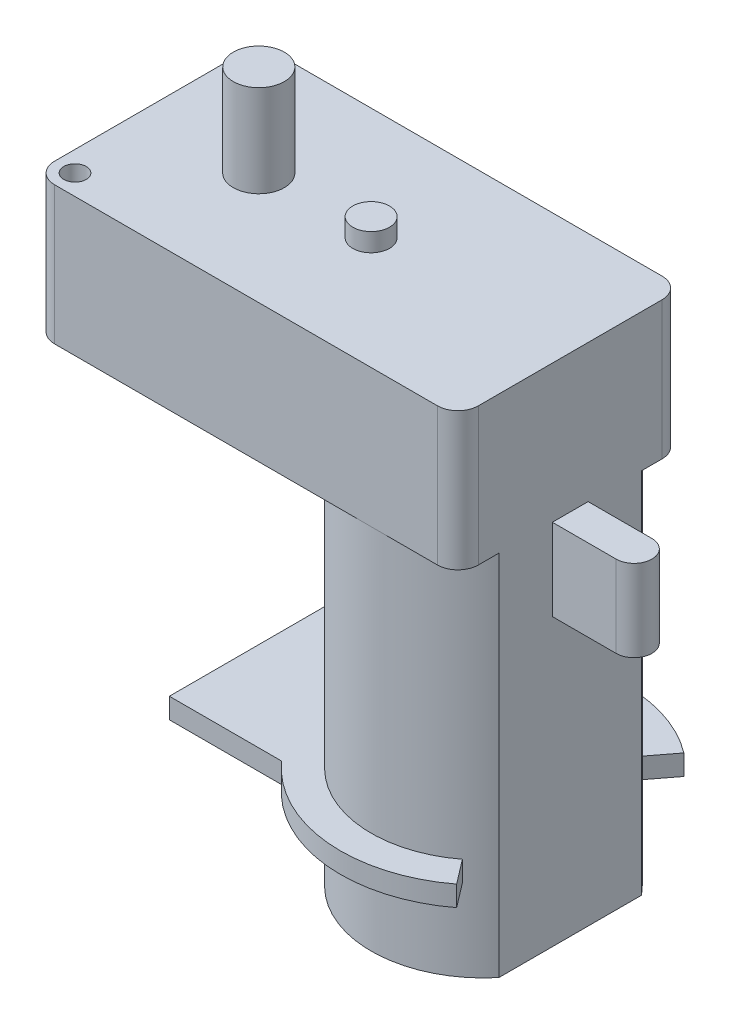
ISO-10303-21;
HEADER;
FILE_DESCRIPTION(('STEP AP214'),'2;1');
FILE_NAME('part.step','',(''),(''),'','','');
FILE_SCHEMA(('AUTOMOTIVE_DESIGN { 1 0 10303 214 1 1 1 1 }'));
ENDSEC;
DATA;
#1=APPLICATION_CONTEXT('core data for automotive mechanical design processes');
#2=APPLICATION_PROTOCOL_DEFINITION('international standard','automotive_design',2000,#1);
#3=PRODUCT_CONTEXT('',#1,'mechanical');
#4=PRODUCT('Part','Part','',(#3));
#5=PRODUCT_RELATED_PRODUCT_CATEGORY('part','',(#4));
#6=PRODUCT_DEFINITION_FORMATION('','',#4);
#7=PRODUCT_DEFINITION_CONTEXT('part definition',#1,'design');
#8=PRODUCT_DEFINITION('design','',#6,#7);
#9=PRODUCT_DEFINITION_SHAPE('','',#8);
#10=(LENGTH_UNIT() NAMED_UNIT(*) SI_UNIT(.MILLI.,.METRE.));
#11=(NAMED_UNIT(*) PLANE_ANGLE_UNIT() SI_UNIT($,.RADIAN.));
#12=(NAMED_UNIT(*) SI_UNIT($,.STERADIAN.) SOLID_ANGLE_UNIT());
#13=UNCERTAINTY_MEASURE_WITH_UNIT(LENGTH_MEASURE(1.E-05),#10,'distance_accuracy_value','');
#14=(GEOMETRIC_REPRESENTATION_CONTEXT(3) GLOBAL_UNCERTAINTY_ASSIGNED_CONTEXT((#13)) GLOBAL_UNIT_ASSIGNED_CONTEXT((#10,
#11,#12)) REPRESENTATION_CONTEXT('',''));
#15=CARTESIAN_POINT('',(0.,0.,0.));
#16=DIRECTION('',(0.,0.,1.));
#17=DIRECTION('',(1.,0.,0.));
#18=AXIS2_PLACEMENT_3D('',#15,#16,#17);
#19=CARTESIAN_POINT('',(27.,0.,0.));
#20=DIRECTION('',(0.,1.,0.));
#21=DIRECTION('',(0.,0.,1.));
#22=AXIS2_PLACEMENT_3D('',#19,#20,#21);
#23=CYLINDRICAL_SURFACE('',#22,1.75);
#24=DIRECTION('',(0.,-1.,0.));
#25=VECTOR('',#24,1.);
#26=CARTESIAN_POINT('',(27.,0.,-1.75));
#27=LINE('',#26,#25);
#28=CARTESIAN_POINT('',(27.,0.,-1.75));
#29=VERTEX_POINT('',#28);
#30=CARTESIAN_POINT('',(27.,-8.,-1.75));
#31=VERTEX_POINT('',#30);
#32=EDGE_CURVE('E229',#29,#31,#27,.T.);
#33=ORIENTED_EDGE('',*,*,#32,.F.);
#34=CARTESIAN_POINT('',(27.,0.,0.));
#35=DIRECTION('',(0.,-1.,0.));
#36=DIRECTION('',(0.,0.,-1.));
#37=AXIS2_PLACEMENT_3D('',#34,#35,#36);
#38=CIRCLE('',#37,1.75);
#39=CARTESIAN_POINT('',(27.,0.,1.75));
#40=VERTEX_POINT('',#39);
#41=EDGE_CURVE('E56',#40,#29,#38,.F.);
#42=ORIENTED_EDGE('',*,*,#41,.F.);
#43=DIRECTION('',(0.,-1.,0.));
#44=VECTOR('',#43,1.);
#45=CARTESIAN_POINT('',(27.,0.,1.75));
#46=LINE('',#45,#44);
#47=CARTESIAN_POINT('',(27.,-8.,1.75));
#48=VERTEX_POINT('',#47);
#49=EDGE_CURVE('E531',#48,#40,#46,.F.);
#50=ORIENTED_EDGE('',*,*,#49,.F.);
#51=CARTESIAN_POINT('',(27.,-8.,0.));
#52=DIRECTION('',(0.,1.,0.));
#53=DIRECTION('',(0.,0.,1.));
#54=AXIS2_PLACEMENT_3D('',#51,#52,#53);
#55=CIRCLE('',#54,1.75);
#56=EDGE_CURVE('E11',#31,#48,#55,.F.);
#57=ORIENTED_EDGE('',*,*,#56,.F.);
#58=EDGE_LOOP('',(#33,#42,#50,#57));
#59=FACE_BOUND('',#58,.T.);
#60=ADVANCED_FACE('F47',(#59),#23,.T.);
#61=CARTESIAN_POINT('',(20.75,13.5,-11.));
#62=DIRECTION('',(-1.,0.,0.));
#63=DIRECTION('',(0.,0.,1.));
#64=AXIS2_PLACEMENT_3D('',#61,#62,#63);
#65=PLANE('',#64);
#66=DIRECTION('',(0.,0.,-1.));
#67=VECTOR('',#66,1.);
#68=CARTESIAN_POINT('',(20.75,0.,-11.));
#69=LINE('',#68,#67);
#70=CARTESIAN_POINT('',(20.75,0.,9.));
#71=VERTEX_POINT('',#70);
#72=CARTESIAN_POINT('',(20.75,0.,6.98212002188448));
#73=VERTEX_POINT('',#72);
#74=EDGE_CURVE('E445',#71,#73,#69,.T.);
#75=ORIENTED_EDGE('',*,*,#74,.T.);
#76=DIRECTION('',(0.,1.,0.));
#77=VECTOR('',#76,1.);
#78=CARTESIAN_POINT('',(20.75,-36.,6.98212002188447));
#79=LINE('',#78,#77);
#80=CARTESIAN_POINT('',(20.75,-36.,6.98212002188447));
#81=VERTEX_POINT('',#80);
#82=EDGE_CURVE('E364',#81,#73,#79,.T.);
#83=ORIENTED_EDGE('',*,*,#82,.F.);
#84=DIRECTION('',(0.,0.,1.));
#85=VECTOR('',#84,1.);
#86=CARTESIAN_POINT('',(20.75,-36.,6.98212002188447));
#87=LINE('',#86,#85);
#88=CARTESIAN_POINT('',(20.75,-36.,-6.98212002188447));
#89=VERTEX_POINT('',#88);
#90=EDGE_CURVE('E361',#89,#81,#87,.T.);
#91=ORIENTED_EDGE('',*,*,#90,.F.);
#92=DIRECTION('',(0.,1.,0.));
#93=VECTOR('',#92,1.);
#94=CARTESIAN_POINT('',(20.75,-36.,-6.98212002188447));
#95=LINE('',#94,#93);
#96=CARTESIAN_POINT('',(20.75,0.,-6.98212002188448));
#97=VERTEX_POINT('',#96);
#98=EDGE_CURVE('E380',#89,#97,#95,.T.);
#99=ORIENTED_EDGE('',*,*,#98,.T.);
#100=CARTESIAN_POINT('',(20.75,0.,-8.99999999999999));
#101=VERTEX_POINT('',#100);
#102=EDGE_CURVE('E420',#97,#101,#69,.T.);
#103=ORIENTED_EDGE('',*,*,#102,.T.);
#104=DIRECTION('',(0.,-1.,0.));
#105=VECTOR('',#104,1.);
#106=CARTESIAN_POINT('',(20.75,13.5,-8.99999999999999));
#107=LINE('',#106,#105);
#108=CARTESIAN_POINT('',(20.75,13.5,-8.99999999999999));
#109=VERTEX_POINT('',#108);
#110=EDGE_CURVE('E513',#101,#109,#107,.F.);
#111=ORIENTED_EDGE('',*,*,#110,.T.);
#112=DIRECTION('',(0.,0.,-1.));
#113=VECTOR('',#112,1.);
#114=CARTESIAN_POINT('',(20.75,13.5,-11.));
#115=LINE('',#114,#113);
#116=CARTESIAN_POINT('',(20.75,13.5,9.));
#117=VERTEX_POINT('',#116);
#118=EDGE_CURVE('E427',#117,#109,#115,.T.);
#119=ORIENTED_EDGE('',*,*,#118,.F.);
#120=DIRECTION('',(0.,-1.,0.));
#121=VECTOR('',#120,1.);
#122=CARTESIAN_POINT('',(20.75,13.5,9.));
#123=LINE('',#122,#121);
#124=EDGE_CURVE('E509',#117,#71,#123,.T.);
#125=ORIENTED_EDGE('',*,*,#124,.T.);
#126=EDGE_LOOP('',(#75,#83,#91,#99,#103,#111,#119,#125));
#127=FACE_BOUND('',#126,.T.);
#128=DIRECTION('',(0.,1.,0.));
#129=VECTOR('',#128,1.);
#130=CARTESIAN_POINT('',(20.75,0.,-1.75));
#131=LINE('',#130,#129);
#132=CARTESIAN_POINT('',(20.75,-8.,-1.75));
#133=VERTEX_POINT('',#132);
#134=CARTESIAN_POINT('',(20.75,0.,-1.75));
#135=VERTEX_POINT('',#134);
#136=EDGE_CURVE('E228',#133,#135,#131,.T.);
#137=ORIENTED_EDGE('',*,*,#136,.F.);
#138=DIRECTION('',(0.,0.,-1.));
#139=VECTOR('',#138,1.);
#140=CARTESIAN_POINT('',(20.75,-8.,1.75));
#141=LINE('',#140,#139);
#142=CARTESIAN_POINT('',(20.75,-8.,1.75));
#143=VERTEX_POINT('',#142);
#144=EDGE_CURVE('E233',#143,#133,#141,.T.);
#145=ORIENTED_EDGE('',*,*,#144,.F.);
#146=DIRECTION('',(0.,-1.,0.));
#147=VECTOR('',#146,1.);
#148=CARTESIAN_POINT('',(20.75,0.,1.75));
#149=LINE('',#148,#147);
#150=CARTESIAN_POINT('',(20.75,0.,1.75));
#151=VERTEX_POINT('',#150);
#152=EDGE_CURVE('E248',#151,#143,#149,.T.);
#153=ORIENTED_EDGE('',*,*,#152,.F.);
#154=DIRECTION('',(0.,0.,1.));
#155=VECTOR('',#154,1.);
#156=CARTESIAN_POINT('',(20.75,0.,1.75));
#157=LINE('',#156,#155);
#158=EDGE_CURVE('E242',#135,#151,#157,.T.);
#159=ORIENTED_EDGE('',*,*,#158,.F.);
#160=EDGE_LOOP('',(#137,#145,#153,#159));
#161=FACE_BOUND('',#160,.T.);
#162=ADVANCED_FACE('F238',(#127,#161),#65,.F.);
#163=CARTESIAN_POINT('',(3.75,-36.,6.98212002188447));
#164=DIRECTION('',(1.,0.,0.));
#165=DIRECTION('',(0.,0.,-1.));
#166=AXIS2_PLACEMENT_3D('',#163,#164,#165);
#167=PLANE('',#166);
#168=DIRECTION('',(0.,0.,-1.));
#169=VECTOR('',#168,1.);
#170=CARTESIAN_POINT('',(3.75,-26.,6.98212002188447));
#171=LINE('',#170,#169);
#172=CARTESIAN_POINT('',(3.75,-26.,6.98212002188447));
#173=VERTEX_POINT('',#172);
#174=CARTESIAN_POINT('',(3.75,-26.,-6.98212002188447));
#175=VERTEX_POINT('',#174);
#176=EDGE_CURVE('E335',#173,#175,#171,.T.);
#177=ORIENTED_EDGE('',*,*,#176,.F.);
#178=DIRECTION('',(0.,1.,0.));
#179=VECTOR('',#178,1.);
#180=CARTESIAN_POINT('',(3.75,-36.,6.98212002188447));
#181=LINE('',#180,#179);
#182=CARTESIAN_POINT('',(3.75,0.,6.98212002188447));
#183=VERTEX_POINT('',#182);
#184=EDGE_CURVE('E389',#173,#183,#181,.T.);
#185=ORIENTED_EDGE('',*,*,#184,.T.);
#186=DIRECTION('',(0.,0.,-1.));
#187=VECTOR('',#186,1.);
#188=CARTESIAN_POINT('',(3.75,0.,6.98212002188447));
#189=LINE('',#188,#187);
#190=CARTESIAN_POINT('',(3.75,0.,-6.98212002188447));
#191=VERTEX_POINT('',#190);
#192=EDGE_CURVE('E368',#183,#191,#189,.T.);
#193=ORIENTED_EDGE('',*,*,#192,.T.);
#194=DIRECTION('',(0.,1.,0.));
#195=VECTOR('',#194,1.);
#196=CARTESIAN_POINT('',(3.75,-36.,-6.98212002188447));
#197=LINE('',#196,#195);
#198=EDGE_CURVE('E384',#175,#191,#197,.T.);
#199=ORIENTED_EDGE('',*,*,#198,.F.);
#200=EDGE_LOOP('',(#177,#185,#193,#199));
#201=FACE_BOUND('',#200,.T.);
#202=ADVANCED_FACE('F553',(#201),#167,.F.);
#203=CARTESIAN_POINT('',(0.,0.,0.));
#204=DIRECTION('',(0.,1.,0.));
#205=DIRECTION('',(0.,0.,1.));
#206=AXIS2_PLACEMENT_3D('',#203,#204,#205);
#207=PLANE('',#206);
#208=CARTESIAN_POINT('',(12.25,0.,0.));
#209=DIRECTION('',(0.,-1.,0.));
#210=DIRECTION('',(0.,0.,-1.));
#211=AXIS2_PLACEMENT_3D('',#208,#209,#210);
#212=CIRCLE('',#211,11.);
#213=CARTESIAN_POINT('',(12.25,0.,-11.));
#214=VERTEX_POINT('',#213);
#215=EDGE_CURVE('E376',#214,#97,#212,.T.);
#216=ORIENTED_EDGE('',*,*,#215,.F.);
#217=DIRECTION('',(-1.,0.,0.));
#218=VECTOR('',#217,1.);
#219=CARTESIAN_POINT('',(-20.75,0.,-11.));
#220=LINE('',#219,#218);
#221=CARTESIAN_POINT('',(18.75,0.,-11.));
#222=VERTEX_POINT('',#221);
#223=EDGE_CURVE('E450',#222,#214,#220,.T.);
#224=ORIENTED_EDGE('',*,*,#223,.F.);
#225=CARTESIAN_POINT('',(18.75,0.,-8.99999999999999));
#226=DIRECTION('',(0.,1.,0.));
#227=DIRECTION('',(0.,0.,1.));
#228=AXIS2_PLACEMENT_3D('',#225,#226,#227);
#229=CIRCLE('',#228,2.);
#230=EDGE_CURVE('E472',#222,#101,#229,.F.);
#231=ORIENTED_EDGE('',*,*,#230,.T.);
#232=ORIENTED_EDGE('',*,*,#102,.F.);
#233=EDGE_LOOP('',(#216,#224,#231,#232));
#234=FACE_BOUND('',#233,.T.);
#235=ADVANCED_FACE('F560',(#234),#207,.F.);
#236=CARTESIAN_POINT('',(12.25,0.,0.));
#237=DIRECTION('',(0.,-1.,0.));
#238=DIRECTION('',(0.,0.,-1.));
#239=AXIS2_PLACEMENT_3D('',#236,#237,#238);
#240=CIRCLE('',#239,11.);
#241=CARTESIAN_POINT('',(12.25,0.,11.));
#242=VERTEX_POINT('',#241);
#243=EDGE_CURVE('E349',#73,#242,#240,.T.);
#244=ORIENTED_EDGE('',*,*,#243,.F.);
#245=ORIENTED_EDGE('',*,*,#74,.F.);
#246=CARTESIAN_POINT('',(18.75,0.,9.));
#247=DIRECTION('',(0.,1.,0.));
#248=DIRECTION('',(0.,0.,1.));
#249=AXIS2_PLACEMENT_3D('',#246,#247,#248);
#250=CIRCLE('',#249,2.);
#251=CARTESIAN_POINT('',(18.75,0.,11.));
#252=VERTEX_POINT('',#251);
#253=EDGE_CURVE('E468',#71,#252,#250,.F.);
#254=ORIENTED_EDGE('',*,*,#253,.T.);
#255=DIRECTION('',(1.,0.,0.));
#256=VECTOR('',#255,1.);
#257=CARTESIAN_POINT('',(-20.75,0.,11.));
#258=LINE('',#257,#256);
#259=EDGE_CURVE('E458',#242,#252,#258,.T.);
#260=ORIENTED_EDGE('',*,*,#259,.F.);
#261=EDGE_LOOP('',(#244,#245,#254,#260));
#262=FACE_BOUND('',#261,.T.);
#263=ADVANCED_FACE('F620',(#262),#207,.F.);
#264=CARTESIAN_POINT('',(-18.75,0.,9.00000000000001));
#265=DIRECTION('',(0.,1.,0.));
#266=DIRECTION('',(0.,0.,1.));
#267=AXIS2_PLACEMENT_3D('',#264,#265,#266);
#268=CIRCLE('',#267,1.1);
#269=CARTESIAN_POINT('',(-18.75,0.,10.1));
#270=VERTEX_POINT('',#269);
#271=EDGE_CURVE('E407',#270,#270,#268,.F.);
#272=ORIENTED_EDGE('',*,*,#271,.F.);
#273=EDGE_LOOP('',(#272));
#274=FACE_BOUND('',#273,.T.);
#275=CARTESIAN_POINT('',(-18.75,0.,-9.));
#276=DIRECTION('',(0.,1.,0.));
#277=DIRECTION('',(0.,0.,1.));
#278=AXIS2_PLACEMENT_3D('',#275,#276,#277);
#279=CIRCLE('',#278,1.1);
#280=CARTESIAN_POINT('',(-18.75,0.,-7.9));
#281=VERTEX_POINT('',#280);
#282=EDGE_CURVE('E415',#281,#281,#279,.F.);
#283=ORIENTED_EDGE('',*,*,#282,.F.);
#284=EDGE_LOOP('',(#283));
#285=FACE_BOUND('',#284,.T.);
#286=EDGE_CURVE('E369',#242,#183,#240,.T.);
#287=ORIENTED_EDGE('',*,*,#286,.F.);
#288=CARTESIAN_POINT('',(-18.75,0.,11.));
#289=VERTEX_POINT('',#288);
#290=EDGE_CURVE('E432',#289,#242,#258,.T.);
#291=ORIENTED_EDGE('',*,*,#290,.F.);
#292=CARTESIAN_POINT('',(-18.75,0.,9.00000000000001));
#293=DIRECTION('',(0.,1.,0.));
#294=DIRECTION('',(0.,0.,1.));
#295=AXIS2_PLACEMENT_3D('',#292,#293,#294);
#296=CIRCLE('',#295,2.);
#297=CARTESIAN_POINT('',(-20.75,0.,9.00000000000001));
#298=VERTEX_POINT('',#297);
#299=EDGE_CURVE('E476',#289,#298,#296,.F.);
#300=ORIENTED_EDGE('',*,*,#299,.T.);
#301=DIRECTION('',(0.,0.,1.));
#302=VECTOR('',#301,1.);
#303=CARTESIAN_POINT('',(-20.75,0.,-11.));
#304=LINE('',#303,#302);
#305=CARTESIAN_POINT('',(-20.75,0.,-9.));
#306=VERTEX_POINT('',#305);
#307=EDGE_CURVE('E454',#306,#298,#304,.T.);
#308=ORIENTED_EDGE('',*,*,#307,.F.);
#309=CARTESIAN_POINT('',(-18.75,0.,-9.));
#310=DIRECTION('',(0.,1.,0.));
#311=DIRECTION('',(0.,0.,1.));
#312=AXIS2_PLACEMENT_3D('',#309,#310,#311);
#313=CIRCLE('',#312,2.);
#314=CARTESIAN_POINT('',(-18.75,0.,-11.));
#315=VERTEX_POINT('',#314);
#316=EDGE_CURVE('E479',#306,#315,#313,.F.);
#317=ORIENTED_EDGE('',*,*,#316,.T.);
#318=EDGE_CURVE('E449',#214,#315,#220,.T.);
#319=ORIENTED_EDGE('',*,*,#318,.F.);
#320=EDGE_CURVE('E355',#191,#214,#212,.T.);
#321=ORIENTED_EDGE('',*,*,#320,.F.);
#322=ORIENTED_EDGE('',*,*,#192,.F.);
#323=EDGE_LOOP('',(#287,#291,#300,#308,#317,#319,#321,#322));
#324=FACE_BOUND('',#323,.T.);
#325=ADVANCED_FACE('F643',(#274,#285,#324),#207,.F.);
#326=CARTESIAN_POINT('',(-20.75,13.5,-11.));
#327=DIRECTION('',(0.,0.,1.));
#328=DIRECTION('',(1.,0.,0.));
#329=AXIS2_PLACEMENT_3D('',#326,#327,#328);
#330=PLANE('',#329);
#331=ORIENTED_EDGE('',*,*,#223,.T.);
#332=ORIENTED_EDGE('',*,*,#318,.T.);
#333=DIRECTION('',(0.,-1.,0.));
#334=VECTOR('',#333,1.);
#335=CARTESIAN_POINT('',(-18.75,13.5,-11.));
#336=LINE('',#335,#334);
#337=CARTESIAN_POINT('',(-18.75,13.5,-11.));
#338=VERTEX_POINT('',#337);
#339=EDGE_CURVE('E487',#315,#338,#336,.F.);
#340=ORIENTED_EDGE('',*,*,#339,.T.);
#341=DIRECTION('',(-1.,0.,0.));
#342=VECTOR('',#341,1.);
#343=CARTESIAN_POINT('',(-20.75,13.5,-11.));
#344=LINE('',#343,#342);
#345=CARTESIAN_POINT('',(18.75,13.5,-11.));
#346=VERTEX_POINT('',#345);
#347=EDGE_CURVE('E431',#346,#338,#344,.T.);
#348=ORIENTED_EDGE('',*,*,#347,.F.);
#349=DIRECTION('',(0.,-1.,0.));
#350=VECTOR('',#349,1.);
#351=CARTESIAN_POINT('',(18.75,13.5,-11.));
#352=LINE('',#351,#350);
#353=EDGE_CURVE('E483',#346,#222,#352,.T.);
#354=ORIENTED_EDGE('',*,*,#353,.T.);
#355=EDGE_LOOP('',(#331,#332,#340,#348,#354));
#356=FACE_BOUND('',#355,.T.);
#357=ADVANCED_FACE('F566',(#356),#330,.F.);
#358=CARTESIAN_POINT('',(-20.75,13.5,-11.));
#359=DIRECTION('',(1.,0.,0.));
#360=DIRECTION('',(0.,0.,-1.));
#361=AXIS2_PLACEMENT_3D('',#358,#359,#360);
#362=PLANE('',#361);
#363=DIRECTION('',(0.,0.,1.));
#364=VECTOR('',#363,1.);
#365=CARTESIAN_POINT('',(-20.75,13.5,-11.));
#366=LINE('',#365,#364);
#367=CARTESIAN_POINT('',(-20.75,13.5,-9.));
#368=VERTEX_POINT('',#367);
#369=CARTESIAN_POINT('',(-20.75,13.5,9.00000000000001));
#370=VERTEX_POINT('',#369);
#371=EDGE_CURVE('E436',#368,#370,#366,.T.);
#372=ORIENTED_EDGE('',*,*,#371,.F.);
#373=DIRECTION('',(0.,-1.,0.));
#374=VECTOR('',#373,1.);
#375=CARTESIAN_POINT('',(-20.75,13.5,-9.));
#376=LINE('',#375,#374);
#377=EDGE_CURVE('E464',#368,#306,#376,.T.);
#378=ORIENTED_EDGE('',*,*,#377,.T.);
#379=ORIENTED_EDGE('',*,*,#307,.T.);
#380=DIRECTION('',(0.,-1.,0.));
#381=VECTOR('',#380,1.);
#382=CARTESIAN_POINT('',(-20.75,13.5,9.00000000000001));
#383=LINE('',#382,#381);
#384=EDGE_CURVE('E444',#298,#370,#383,.F.);
#385=ORIENTED_EDGE('',*,*,#384,.T.);
#386=EDGE_LOOP('',(#372,#378,#379,#385));
#387=FACE_BOUND('',#386,.T.);
#388=ADVANCED_FACE('F610',(#387),#362,.F.);
#389=CARTESIAN_POINT('',(-20.75,13.5,11.));
#390=DIRECTION('',(0.,0.,-1.));
#391=DIRECTION('',(-1.,0.,0.));
#392=AXIS2_PLACEMENT_3D('',#389,#390,#391);
#393=PLANE('',#392);
#394=DIRECTION('',(1.,0.,0.));
#395=VECTOR('',#394,1.);
#396=CARTESIAN_POINT('',(-20.75,13.5,11.));
#397=LINE('',#396,#395);
#398=CARTESIAN_POINT('',(-18.75,13.5,11.));
#399=VERTEX_POINT('',#398);
#400=CARTESIAN_POINT('',(18.75,13.5,11.));
#401=VERTEX_POINT('',#400);
#402=EDGE_CURVE('E440',#399,#401,#397,.T.);
#403=ORIENTED_EDGE('',*,*,#402,.F.);
#404=DIRECTION('',(0.,-1.,0.));
#405=VECTOR('',#404,1.);
#406=CARTESIAN_POINT('',(-18.75,13.5,11.));
#407=LINE('',#406,#405);
#408=EDGE_CURVE('E505',#399,#289,#407,.T.);
#409=ORIENTED_EDGE('',*,*,#408,.T.);
#410=ORIENTED_EDGE('',*,*,#290,.T.);
#411=ORIENTED_EDGE('',*,*,#259,.T.);
#412=DIRECTION('',(0.,-1.,0.));
#413=VECTOR('',#412,1.);
#414=CARTESIAN_POINT('',(18.75,13.5,11.));
#415=LINE('',#414,#413);
#416=EDGE_CURVE('E502',#252,#401,#415,.F.);
#417=ORIENTED_EDGE('',*,*,#416,.T.);
#418=EDGE_LOOP('',(#403,#409,#410,#411,#417));
#419=FACE_BOUND('',#418,.T.);
#420=ADVANCED_FACE('F615',(#419),#393,.F.);
#421=CARTESIAN_POINT('',(0.,13.5,0.));
#422=DIRECTION('',(0.,1.,0.));
#423=DIRECTION('',(0.,0.,1.));
#424=AXIS2_PLACEMENT_3D('',#421,#422,#423);
#425=PLANE('',#424);
#426=CARTESIAN_POINT('',(1.25,13.5,0.));
#427=DIRECTION('',(0.,1.,0.));
#428=DIRECTION('',(0.,0.,1.));
#429=AXIS2_PLACEMENT_3D('',#426,#427,#428);
#430=CIRCLE('',#429,1.8);
#431=CARTESIAN_POINT('',(1.25,13.5,1.8));
#432=VERTEX_POINT('',#431);
#433=EDGE_CURVE('E394',#432,#432,#430,.T.);
#434=ORIENTED_EDGE('',*,*,#433,.F.);
#435=EDGE_LOOP('',(#434));
#436=FACE_BOUND('',#435,.T.);
#437=CARTESIAN_POINT('',(-9.75,13.5,0.));
#438=DIRECTION('',(0.,1.,0.));
#439=DIRECTION('',(0.,0.,1.));
#440=AXIS2_PLACEMENT_3D('',#437,#438,#439);
#441=CIRCLE('',#440,2.5);
#442=CARTESIAN_POINT('',(-9.75,13.5,2.5));
#443=VERTEX_POINT('',#442);
#444=EDGE_CURVE('E399',#443,#443,#441,.T.);
#445=ORIENTED_EDGE('',*,*,#444,.F.);
#446=EDGE_LOOP('',(#445));
#447=FACE_BOUND('',#446,.T.);
#448=CARTESIAN_POINT('',(-18.75,13.5,-9.));
#449=DIRECTION('',(0.,1.,0.));
#450=DIRECTION('',(0.,0.,1.));
#451=AXIS2_PLACEMENT_3D('',#448,#449,#450);
#452=CIRCLE('',#451,1.1);
#453=CARTESIAN_POINT('',(-18.75,13.5,-7.9));
#454=VERTEX_POINT('',#453);
#455=EDGE_CURVE('E411',#454,#454,#452,.T.);
#456=ORIENTED_EDGE('',*,*,#455,.F.);
#457=EDGE_LOOP('',(#456));
#458=FACE_BOUND('',#457,.T.);
#459=CARTESIAN_POINT('',(-18.75,13.5,9.00000000000001));
#460=DIRECTION('',(0.,1.,0.));
#461=DIRECTION('',(0.,0.,1.));
#462=AXIS2_PLACEMENT_3D('',#459,#460,#461);
#463=CIRCLE('',#462,1.1);
#464=CARTESIAN_POINT('',(-18.75,13.5,10.1));
#465=VERTEX_POINT('',#464);
#466=EDGE_CURVE('E416',#465,#465,#463,.T.);
#467=ORIENTED_EDGE('',*,*,#466,.F.);
#468=EDGE_LOOP('',(#467));
#469=FACE_BOUND('',#468,.T.);
#470=ORIENTED_EDGE('',*,*,#347,.T.);
#471=CARTESIAN_POINT('',(-18.75,13.5,-9.));
#472=DIRECTION('',(0.,1.,0.));
#473=DIRECTION('',(0.,0.,1.));
#474=AXIS2_PLACEMENT_3D('',#471,#472,#473);
#475=CIRCLE('',#474,2.);
#476=EDGE_CURVE('E499',#338,#368,#475,.T.);
#477=ORIENTED_EDGE('',*,*,#476,.T.);
#478=ORIENTED_EDGE('',*,*,#371,.T.);
#479=CARTESIAN_POINT('',(-18.75,13.5,9.00000000000001));
#480=DIRECTION('',(0.,1.,0.));
#481=DIRECTION('',(0.,0.,1.));
#482=AXIS2_PLACEMENT_3D('',#479,#480,#481);
#483=CIRCLE('',#482,2.);
#484=EDGE_CURVE('E496',#370,#399,#483,.T.);
#485=ORIENTED_EDGE('',*,*,#484,.T.);
#486=ORIENTED_EDGE('',*,*,#402,.T.);
#487=CARTESIAN_POINT('',(18.75,13.5,9.));
#488=DIRECTION('',(0.,1.,0.));
#489=DIRECTION('',(0.,0.,1.));
#490=AXIS2_PLACEMENT_3D('',#487,#488,#489);
#491=CIRCLE('',#490,2.);
#492=EDGE_CURVE('E490',#401,#117,#491,.T.);
#493=ORIENTED_EDGE('',*,*,#492,.T.);
#494=ORIENTED_EDGE('',*,*,#118,.T.);
#495=CARTESIAN_POINT('',(18.75,13.5,-8.99999999999999));
#496=DIRECTION('',(0.,1.,0.));
#497=DIRECTION('',(0.,0.,1.));
#498=AXIS2_PLACEMENT_3D('',#495,#496,#497);
#499=CIRCLE('',#498,2.);
#500=EDGE_CURVE('E493',#109,#346,#499,.T.);
#501=ORIENTED_EDGE('',*,*,#500,.T.);
#502=EDGE_LOOP('',(#470,#477,#478,#485,#486,#493,#494,#501));
#503=FACE_BOUND('',#502,.T.);
#504=ADVANCED_FACE('F572',(#436,#447,#458,#469,#503),#425,.T.);
#505=CARTESIAN_POINT('',(-18.75,13.5,-9.));
#506=DIRECTION('',(0.,-1.,0.));
#507=DIRECTION('',(0.,0.,-1.));
#508=AXIS2_PLACEMENT_3D('',#505,#506,#507);
#509=CYLINDRICAL_SURFACE('',#508,2.);
#510=ORIENTED_EDGE('',*,*,#476,.F.);
#511=ORIENTED_EDGE('',*,*,#339,.F.);
#512=ORIENTED_EDGE('',*,*,#316,.F.);
#513=ORIENTED_EDGE('',*,*,#377,.F.);
#514=EDGE_LOOP('',(#510,#511,#512,#513));
#515=FACE_BOUND('',#514,.T.);
#516=ADVANCED_FACE('F568',(#515),#509,.T.);
#517=CARTESIAN_POINT('',(-18.75,13.5,9.00000000000001));
#518=DIRECTION('',(0.,-1.,0.));
#519=DIRECTION('',(0.,0.,-1.));
#520=AXIS2_PLACEMENT_3D('',#517,#518,#519);
#521=CYLINDRICAL_SURFACE('',#520,2.);
#522=ORIENTED_EDGE('',*,*,#484,.F.);
#523=ORIENTED_EDGE('',*,*,#384,.F.);
#524=ORIENTED_EDGE('',*,*,#299,.F.);
#525=ORIENTED_EDGE('',*,*,#408,.F.);
#526=EDGE_LOOP('',(#522,#523,#524,#525));
#527=FACE_BOUND('',#526,.T.);
#528=ADVANCED_FACE('F571',(#527),#521,.T.);
#529=CARTESIAN_POINT('',(18.75,13.5,-8.99999999999999));
#530=DIRECTION('',(0.,-1.,0.));
#531=DIRECTION('',(0.,0.,-1.));
#532=AXIS2_PLACEMENT_3D('',#529,#530,#531);
#533=CYLINDRICAL_SURFACE('',#532,2.);
#534=ORIENTED_EDGE('',*,*,#500,.F.);
#535=ORIENTED_EDGE('',*,*,#110,.F.);
#536=ORIENTED_EDGE('',*,*,#230,.F.);
#537=ORIENTED_EDGE('',*,*,#353,.F.);
#538=EDGE_LOOP('',(#534,#535,#536,#537));
#539=FACE_BOUND('',#538,.T.);
#540=ADVANCED_FACE('F576',(#539),#533,.T.);
#541=CARTESIAN_POINT('',(18.75,13.5,9.));
#542=DIRECTION('',(0.,-1.,0.));
#543=DIRECTION('',(0.,0.,-1.));
#544=AXIS2_PLACEMENT_3D('',#541,#542,#543);
#545=CYLINDRICAL_SURFACE('',#544,2.);
#546=ORIENTED_EDGE('',*,*,#492,.F.);
#547=ORIENTED_EDGE('',*,*,#416,.F.);
#548=ORIENTED_EDGE('',*,*,#253,.F.);
#549=ORIENTED_EDGE('',*,*,#124,.F.);
#550=EDGE_LOOP('',(#546,#547,#548,#549));
#551=FACE_BOUND('',#550,.T.);
#552=ADVANCED_FACE('F579',(#551),#545,.T.);
#553=CARTESIAN_POINT('',(-18.75,-3.11126983722081,9.00000000000001));
#554=DIRECTION('',(0.,1.,0.));
#555=DIRECTION('',(0.,0.,1.));
#556=AXIS2_PLACEMENT_3D('',#553,#554,#555);
#557=CYLINDRICAL_SURFACE('',#556,1.1);
#558=ORIENTED_EDGE('',*,*,#271,.T.);
#559=EDGE_LOOP('',(#558));
#560=FACE_BOUND('',#559,.T.);
#561=ORIENTED_EDGE('',*,*,#466,.T.);
#562=EDGE_LOOP('',(#561));
#563=FACE_BOUND('',#562,.T.);
#564=ADVANCED_FACE('F582',(#560,#563),#557,.F.);
#565=CARTESIAN_POINT('',(-18.75,-3.11126983722081,-9.));
#566=DIRECTION('',(0.,1.,0.));
#567=DIRECTION('',(0.,0.,1.));
#568=AXIS2_PLACEMENT_3D('',#565,#566,#567);
#569=CYLINDRICAL_SURFACE('',#568,1.1);
#570=ORIENTED_EDGE('',*,*,#282,.T.);
#571=EDGE_LOOP('',(#570));
#572=FACE_BOUND('',#571,.T.);
#573=ORIENTED_EDGE('',*,*,#455,.T.);
#574=EDGE_LOOP('',(#573));
#575=FACE_BOUND('',#574,.T.);
#576=ADVANCED_FACE('F587',(#572,#575),#569,.F.);
#577=CARTESIAN_POINT('',(-9.75,22.5,0.));
#578=DIRECTION('',(0.,-1.,0.));
#579=DIRECTION('',(0.,0.,-1.));
#580=AXIS2_PLACEMENT_3D('',#577,#578,#579);
#581=CYLINDRICAL_SURFACE('',#580,2.5);
#582=CARTESIAN_POINT('',(-9.75,22.5,0.));
#583=DIRECTION('',(0.,1.,0.));
#584=DIRECTION('',(0.,0.,1.));
#585=AXIS2_PLACEMENT_3D('',#582,#583,#584);
#586=CIRCLE('',#585,2.5);
#587=CARTESIAN_POINT('',(-9.75,22.5,2.5));
#588=VERTEX_POINT('',#587);
#589=EDGE_CURVE('E403',#588,#588,#586,.T.);
#590=ORIENTED_EDGE('',*,*,#589,.F.);
#591=EDGE_LOOP('',(#590));
#592=FACE_BOUND('',#591,.T.);
#593=ORIENTED_EDGE('',*,*,#444,.T.);
#594=EDGE_LOOP('',(#593));
#595=FACE_BOUND('',#594,.T.);
#596=ADVANCED_FACE('F706',(#592,#595),#581,.T.);
#597=CARTESIAN_POINT('',(-9.75,22.5,0.));
#598=DIRECTION('',(0.,1.,0.));
#599=DIRECTION('',(0.,0.,1.));
#600=AXIS2_PLACEMENT_3D('',#597,#598,#599);
#601=PLANE('',#600);
#602=ORIENTED_EDGE('',*,*,#589,.T.);
#603=EDGE_LOOP('',(#602));
#604=FACE_BOUND('',#603,.T.);
#605=ADVANCED_FACE('F702',(#604),#601,.T.);
#606=CARTESIAN_POINT('',(1.25,15.3,0.));
#607=DIRECTION('',(0.,-1.,0.));
#608=DIRECTION('',(0.,0.,-1.));
#609=AXIS2_PLACEMENT_3D('',#606,#607,#608);
#610=CYLINDRICAL_SURFACE('',#609,1.8);
#611=CARTESIAN_POINT('',(1.25,15.3,0.));
#612=DIRECTION('',(0.,1.,0.));
#613=DIRECTION('',(0.,0.,1.));
#614=AXIS2_PLACEMENT_3D('',#611,#612,#613);
#615=CIRCLE('',#614,1.8);
#616=CARTESIAN_POINT('',(1.25,15.3,1.8));
#617=VERTEX_POINT('',#616);
#618=EDGE_CURVE('E395',#617,#617,#615,.T.);
#619=ORIENTED_EDGE('',*,*,#618,.F.);
#620=EDGE_LOOP('',(#619));
#621=FACE_BOUND('',#620,.T.);
#622=ORIENTED_EDGE('',*,*,#433,.T.);
#623=EDGE_LOOP('',(#622));
#624=FACE_BOUND('',#623,.T.);
#625=ADVANCED_FACE('F698',(#621,#624),#610,.T.);
#626=CARTESIAN_POINT('',(1.25,15.3,0.));
#627=DIRECTION('',(0.,1.,0.));
#628=DIRECTION('',(0.,0.,1.));
#629=AXIS2_PLACEMENT_3D('',#626,#627,#628);
#630=PLANE('',#629);
#631=ORIENTED_EDGE('',*,*,#618,.T.);
#632=EDGE_LOOP('',(#631));
#633=FACE_BOUND('',#632,.T.);
#634=ADVANCED_FACE('F692',(#633),#630,.T.);
#635=CARTESIAN_POINT('',(12.25,-36.,0.));
#636=DIRECTION('',(0.,1.,0.));
#637=DIRECTION('',(0.,0.,1.));
#638=AXIS2_PLACEMENT_3D('',#635,#636,#637);
#639=CYLINDRICAL_SURFACE('',#638,11.);
#640=DIRECTION('',(0.,1.,0.));
#641=VECTOR('',#640,1.);
#642=CARTESIAN_POINT('',(18.9285714285714,-36.,8.74051964550561));
#643=LINE('',#642,#641);
#644=CARTESIAN_POINT('',(18.9285714285714,-26.,8.74051964550561));
#645=VERTEX_POINT('',#644);
#646=CARTESIAN_POINT('',(18.9285714285714,-28.,8.74051964550561));
#647=VERTEX_POINT('',#646);
#648=EDGE_CURVE('E526',#645,#647,#643,.F.);
#649=ORIENTED_EDGE('',*,*,#648,.T.);
#650=CARTESIAN_POINT('',(12.25,-28.,0.));
#651=DIRECTION('',(0.,-1.,0.));
#652=DIRECTION('',(0.,0.,-1.));
#653=AXIS2_PLACEMENT_3D('',#650,#651,#652);
#654=CIRCLE('',#653,11.);
#655=CARTESIAN_POINT('',(3.75,-28.,6.98212002188447));
#656=VERTEX_POINT('',#655);
#657=EDGE_CURVE('E346',#647,#656,#654,.T.);
#658=ORIENTED_EDGE('',*,*,#657,.T.);
#659=CARTESIAN_POINT('',(3.75,-36.,6.98212002188447));
#660=VERTEX_POINT('',#659);
#661=EDGE_CURVE('E390',#660,#656,#181,.T.);
#662=ORIENTED_EDGE('',*,*,#661,.F.);
#663=CARTESIAN_POINT('',(12.25,-36.,0.));
#664=DIRECTION('',(0.,-1.,0.));
#665=DIRECTION('',(0.,0.,-1.));
#666=AXIS2_PLACEMENT_3D('',#663,#664,#665);
#667=CIRCLE('',#666,11.);
#668=EDGE_CURVE('E350',#81,#660,#667,.T.);
#669=ORIENTED_EDGE('',*,*,#668,.F.);
#670=ORIENTED_EDGE('',*,*,#82,.T.);
#671=ORIENTED_EDGE('',*,*,#243,.T.);
#672=ORIENTED_EDGE('',*,*,#286,.T.);
#673=ORIENTED_EDGE('',*,*,#184,.F.);
#674=CARTESIAN_POINT('',(12.25,-26.,0.));
#675=DIRECTION('',(0.,-1.,0.));
#676=DIRECTION('',(0.,0.,-1.));
#677=AXIS2_PLACEMENT_3D('',#674,#675,#676);
#678=CIRCLE('',#677,11.);
#679=EDGE_CURVE('E339',#645,#173,#678,.T.);
#680=ORIENTED_EDGE('',*,*,#679,.F.);
#681=EDGE_LOOP('',(#649,#658,#662,#669,#670,#671,#672,#673,#680));
#682=FACE_BOUND('',#681,.T.);
#683=ADVANCED_FACE('F625',(#682),#639,.T.);
#684=ORIENTED_EDGE('',*,*,#661,.T.);
#685=DIRECTION('',(0.,0.,-1.));
#686=VECTOR('',#685,1.);
#687=CARTESIAN_POINT('',(3.75,-28.,6.98212002188447));
#688=LINE('',#687,#686);
#689=CARTESIAN_POINT('',(3.75,-28.,-6.98212002188447));
#690=VERTEX_POINT('',#689);
#691=EDGE_CURVE('E343',#656,#690,#688,.T.);
#692=ORIENTED_EDGE('',*,*,#691,.T.);
#693=CARTESIAN_POINT('',(3.75,-36.,-6.98212002188447));
#694=VERTEX_POINT('',#693);
#695=EDGE_CURVE('E385',#694,#690,#197,.T.);
#696=ORIENTED_EDGE('',*,*,#695,.F.);
#697=DIRECTION('',(0.,0.,-1.));
#698=VECTOR('',#697,1.);
#699=CARTESIAN_POINT('',(3.75,-36.,6.98212002188447));
#700=LINE('',#699,#698);
#701=EDGE_CURVE('E354',#660,#694,#700,.T.);
#702=ORIENTED_EDGE('',*,*,#701,.F.);
#703=EDGE_LOOP('',(#684,#692,#696,#702));
#704=FACE_BOUND('',#703,.T.);
#705=ADVANCED_FACE('F563',(#704),#167,.F.);
#706=CARTESIAN_POINT('',(12.25,-36.,0.));
#707=DIRECTION('',(0.,1.,0.));
#708=DIRECTION('',(0.,0.,1.));
#709=AXIS2_PLACEMENT_3D('',#706,#707,#708);
#710=CYLINDRICAL_SURFACE('',#709,11.);
#711=ORIENTED_EDGE('',*,*,#695,.T.);
#712=CARTESIAN_POINT('',(12.25,-28.,0.));
#713=DIRECTION('',(0.,-1.,0.));
#714=DIRECTION('',(0.,0.,-1.));
#715=AXIS2_PLACEMENT_3D('',#712,#713,#714);
#716=CIRCLE('',#715,11.);
#717=CARTESIAN_POINT('',(18.9285714285714,-28.,-8.7405196455056));
#718=VERTEX_POINT('',#717);
#719=EDGE_CURVE('E523',#690,#718,#716,.T.);
#720=ORIENTED_EDGE('',*,*,#719,.T.);
#721=DIRECTION('',(0.,1.,0.));
#722=VECTOR('',#721,1.);
#723=CARTESIAN_POINT('',(18.9285714285714,-36.,-8.7405196455056));
#724=LINE('',#723,#722);
#725=CARTESIAN_POINT('',(18.9285714285714,-26.,-8.7405196455056));
#726=VERTEX_POINT('',#725);
#727=EDGE_CURVE('E520',#718,#726,#724,.T.);
#728=ORIENTED_EDGE('',*,*,#727,.T.);
#729=CARTESIAN_POINT('',(12.25,-26.,0.));
#730=DIRECTION('',(0.,-1.,0.));
#731=DIRECTION('',(0.,0.,-1.));
#732=AXIS2_PLACEMENT_3D('',#729,#730,#731);
#733=CIRCLE('',#732,11.);
#734=EDGE_CURVE('E516',#175,#726,#733,.T.);
#735=ORIENTED_EDGE('',*,*,#734,.F.);
#736=ORIENTED_EDGE('',*,*,#198,.T.);
#737=ORIENTED_EDGE('',*,*,#320,.T.);
#738=ORIENTED_EDGE('',*,*,#215,.T.);
#739=ORIENTED_EDGE('',*,*,#98,.F.);
#740=CARTESIAN_POINT('',(12.25,-36.,0.));
#741=DIRECTION('',(0.,-1.,0.));
#742=DIRECTION('',(0.,0.,-1.));
#743=AXIS2_PLACEMENT_3D('',#740,#741,#742);
#744=CIRCLE('',#743,11.);
#745=EDGE_CURVE('E358',#694,#89,#744,.T.);
#746=ORIENTED_EDGE('',*,*,#745,.F.);
#747=EDGE_LOOP('',(#711,#720,#728,#735,#736,#737,#738,#739,#746));
#748=FACE_BOUND('',#747,.T.);
#749=ADVANCED_FACE('F635',(#748),#710,.T.);
#750=CARTESIAN_POINT('',(12.25,-36.,0.));
#751=DIRECTION('',(0.,-1.,0.));
#752=DIRECTION('',(0.,0.,-1.));
#753=AXIS2_PLACEMENT_3D('',#750,#751,#752);
#754=PLANE('',#753);
#755=ORIENTED_EDGE('',*,*,#668,.T.);
#756=ORIENTED_EDGE('',*,*,#701,.T.);
#757=ORIENTED_EDGE('',*,*,#745,.T.);
#758=ORIENTED_EDGE('',*,*,#90,.T.);
#759=EDGE_LOOP('',(#755,#756,#757,#758));
#760=FACE_BOUND('',#759,.T.);
#761=ADVANCED_FACE('F629',(#760),#754,.T.);
#762=CARTESIAN_POINT('',(20.75,-28.,11.1242977306435));
#763=DIRECTION('',(0.794592695045964,0.,-0.607142857142857));
#764=DIRECTION('',(-0.607142857142857,0.,-0.794592695045964));
#765=AXIS2_PLACEMENT_3D('',#762,#763,#764);
#766=PLANE('',#765);
#767=ORIENTED_EDGE('',*,*,#648,.F.);
#768=DIRECTION('',(-0.607142857142857,0.,-0.794592695045964));
#769=VECTOR('',#768,1.);
#770=CARTESIAN_POINT('',(20.75,-26.,11.1242977306435));
#771=LINE('',#770,#769);
#772=CARTESIAN_POINT('',(20.75,-26.,11.1242977306435));
#773=VERTEX_POINT('',#772);
#774=EDGE_CURVE('E262',#773,#645,#771,.T.);
#775=ORIENTED_EDGE('',*,*,#774,.F.);
#776=DIRECTION('',(0.,1.,0.));
#777=VECTOR('',#776,1.);
#778=CARTESIAN_POINT('',(20.75,-28.,11.1242977306435));
#779=LINE('',#778,#777);
#780=CARTESIAN_POINT('',(20.75,-28.,11.1242977306435));
#781=VERTEX_POINT('',#780);
#782=EDGE_CURVE('E332',#781,#773,#779,.T.);
#783=ORIENTED_EDGE('',*,*,#782,.F.);
#784=DIRECTION('',(-0.607142857142857,0.,-0.794592695045964));
#785=VECTOR('',#784,1.);
#786=CARTESIAN_POINT('',(20.75,-28.,11.1242977306435));
#787=LINE('',#786,#785);
#788=EDGE_CURVE('E263',#781,#647,#787,.T.);
#789=ORIENTED_EDGE('',*,*,#788,.T.);
#790=EDGE_LOOP('',(#767,#775,#783,#789));
#791=FACE_BOUND('',#790,.T.);
#792=ADVANCED_FACE('F679',(#791),#766,.T.);
#793=CARTESIAN_POINT('',(14.6785714285714,-28.,-3.17837078018386));
#794=DIRECTION('',(0.794592695045964,0.,0.607142857142857));
#795=DIRECTION('',(0.607142857142857,0.,-0.794592695045964));
#796=AXIS2_PLACEMENT_3D('',#793,#794,#795);
#797=PLANE('',#796);
#798=ORIENTED_EDGE('',*,*,#727,.F.);
#799=DIRECTION('',(0.607142857142857,0.,-0.794592695045964));
#800=VECTOR('',#799,1.);
#801=CARTESIAN_POINT('',(14.6785714285714,-28.,-3.17837078018386));
#802=LINE('',#801,#800);
#803=CARTESIAN_POINT('',(20.75,-28.,-11.1242977306435));
#804=VERTEX_POINT('',#803);
#805=EDGE_CURVE('E288',#718,#804,#802,.T.);
#806=ORIENTED_EDGE('',*,*,#805,.T.);
#807=DIRECTION('',(0.,1.,0.));
#808=VECTOR('',#807,1.);
#809=CARTESIAN_POINT('',(20.75,-28.,-11.1242977306435));
#810=LINE('',#809,#808);
#811=CARTESIAN_POINT('',(20.75,-26.,-11.1242977306435));
#812=VERTEX_POINT('',#811);
#813=EDGE_CURVE('E291',#804,#812,#810,.T.);
#814=ORIENTED_EDGE('',*,*,#813,.T.);
#815=DIRECTION('',(0.607142857142857,0.,-0.794592695045964));
#816=VECTOR('',#815,1.);
#817=CARTESIAN_POINT('',(14.6785714285714,-26.,-3.17837078018386));
#818=LINE('',#817,#816);
#819=EDGE_CURVE('E268',#726,#812,#818,.T.);
#820=ORIENTED_EDGE('',*,*,#819,.F.);
#821=EDGE_LOOP('',(#798,#806,#814,#820));
#822=FACE_BOUND('',#821,.T.);
#823=ADVANCED_FACE('F652',(#822),#797,.T.);
#824=CARTESIAN_POINT('',(12.25,-28.,0.));
#825=DIRECTION('',(0.,1.,0.));
#826=DIRECTION('',(0.,0.,1.));
#827=AXIS2_PLACEMENT_3D('',#824,#825,#826);
#828=CYLINDRICAL_SURFACE('',#827,14.);
#829=CARTESIAN_POINT('',(12.25,-26.,0.));
#830=DIRECTION('',(0.,1.,0.));
#831=DIRECTION('',(0.,0.,1.));
#832=AXIS2_PLACEMENT_3D('',#829,#830,#831);
#833=CIRCLE('',#832,14.);
#834=CARTESIAN_POINT('',(1.75,-26.,9.26012958872606));
#835=VERTEX_POINT('',#834);
#836=EDGE_CURVE('E295',#835,#773,#833,.T.);
#837=ORIENTED_EDGE('',*,*,#836,.F.);
#838=DIRECTION('',(0.,1.,0.));
#839=VECTOR('',#838,1.);
#840=CARTESIAN_POINT('',(1.75,-28.,9.26012958872606));
#841=LINE('',#840,#839);
#842=CARTESIAN_POINT('',(1.75,-28.,9.26012958872606));
#843=VERTEX_POINT('',#842);
#844=EDGE_CURVE('E329',#843,#835,#841,.T.);
#845=ORIENTED_EDGE('',*,*,#844,.F.);
#846=CARTESIAN_POINT('',(12.25,-28.,0.));
#847=DIRECTION('',(0.,1.,0.));
#848=DIRECTION('',(0.,0.,1.));
#849=AXIS2_PLACEMENT_3D('',#846,#847,#848);
#850=CIRCLE('',#849,14.);
#851=EDGE_CURVE('E267',#843,#781,#850,.T.);
#852=ORIENTED_EDGE('',*,*,#851,.T.);
#853=ORIENTED_EDGE('',*,*,#782,.T.);
#854=EDGE_LOOP('',(#837,#845,#852,#853));
#855=FACE_BOUND('',#854,.T.);
#856=ADVANCED_FACE('F674',(#855),#828,.T.);
#857=CARTESIAN_POINT('',(1.75,-28.,9.26012958872606));
#858=DIRECTION('',(0.,0.,1.));
#859=DIRECTION('',(1.,0.,0.));
#860=AXIS2_PLACEMENT_3D('',#857,#858,#859);
#861=PLANE('',#860);
#862=DIRECTION('',(1.,0.,0.));
#863=VECTOR('',#862,1.);
#864=CARTESIAN_POINT('',(1.75,-26.,9.26012958872606));
#865=LINE('',#864,#863);
#866=CARTESIAN_POINT('',(-9.25,-26.,9.26012958872606));
#867=VERTEX_POINT('',#866);
#868=EDGE_CURVE('E299',#867,#835,#865,.T.);
#869=ORIENTED_EDGE('',*,*,#868,.F.);
#870=DIRECTION('',(0.,1.,0.));
#871=VECTOR('',#870,1.);
#872=CARTESIAN_POINT('',(-9.25,-28.,9.26012958872606));
#873=LINE('',#872,#871);
#874=CARTESIAN_POINT('',(-9.25,-28.,9.26012958872606));
#875=VERTEX_POINT('',#874);
#876=EDGE_CURVE('E326',#875,#867,#873,.T.);
#877=ORIENTED_EDGE('',*,*,#876,.F.);
#878=DIRECTION('',(1.,0.,0.));
#879=VECTOR('',#878,1.);
#880=CARTESIAN_POINT('',(1.75,-28.,9.26012958872606));
#881=LINE('',#880,#879);
#882=EDGE_CURVE('E272',#875,#843,#881,.T.);
#883=ORIENTED_EDGE('',*,*,#882,.T.);
#884=ORIENTED_EDGE('',*,*,#844,.T.);
#885=EDGE_LOOP('',(#869,#877,#883,#884));
#886=FACE_BOUND('',#885,.T.);
#887=ADVANCED_FACE('F670',(#886),#861,.T.);
#888=CARTESIAN_POINT('',(-9.25,-28.,-9.26012958872606));
#889=DIRECTION('',(-1.,0.,0.));
#890=DIRECTION('',(0.,0.,1.));
#891=AXIS2_PLACEMENT_3D('',#888,#889,#890);
#892=PLANE('',#891);
#893=DIRECTION('',(0.,0.,1.));
#894=VECTOR('',#893,1.);
#895=CARTESIAN_POINT('',(-9.25,-26.,-9.26012958872606));
#896=LINE('',#895,#894);
#897=CARTESIAN_POINT('',(-9.25,-26.,-9.26012958872606));
#898=VERTEX_POINT('',#897);
#899=EDGE_CURVE('E303',#898,#867,#896,.T.);
#900=ORIENTED_EDGE('',*,*,#899,.F.);
#901=DIRECTION('',(0.,1.,0.));
#902=VECTOR('',#901,1.);
#903=CARTESIAN_POINT('',(-9.25,-28.,-9.26012958872606));
#904=LINE('',#903,#902);
#905=CARTESIAN_POINT('',(-9.25,-28.,-9.26012958872606));
#906=VERTEX_POINT('',#905);
#907=EDGE_CURVE('E323',#906,#898,#904,.T.);
#908=ORIENTED_EDGE('',*,*,#907,.F.);
#909=DIRECTION('',(0.,0.,1.));
#910=VECTOR('',#909,1.);
#911=CARTESIAN_POINT('',(-9.25,-28.,-9.26012958872606));
#912=LINE('',#911,#910);
#913=EDGE_CURVE('E276',#906,#875,#912,.T.);
#914=ORIENTED_EDGE('',*,*,#913,.T.);
#915=ORIENTED_EDGE('',*,*,#876,.T.);
#916=EDGE_LOOP('',(#900,#908,#914,#915));
#917=FACE_BOUND('',#916,.T.);
#918=ADVANCED_FACE('F666',(#917),#892,.T.);
#919=CARTESIAN_POINT('',(1.75,-28.,-9.26012958872606));
#920=DIRECTION('',(0.,0.,-1.));
#921=DIRECTION('',(-1.,0.,0.));
#922=AXIS2_PLACEMENT_3D('',#919,#920,#921);
#923=PLANE('',#922);
#924=DIRECTION('',(-1.,0.,0.));
#925=VECTOR('',#924,1.);
#926=CARTESIAN_POINT('',(1.75,-26.,-9.26012958872606));
#927=LINE('',#926,#925);
#928=CARTESIAN_POINT('',(1.75,-26.,-9.26012958872606));
#929=VERTEX_POINT('',#928);
#930=EDGE_CURVE('E307',#929,#898,#927,.T.);
#931=ORIENTED_EDGE('',*,*,#930,.F.);
#932=DIRECTION('',(0.,1.,0.));
#933=VECTOR('',#932,1.);
#934=CARTESIAN_POINT('',(1.75,-28.,-9.26012958872606));
#935=LINE('',#934,#933);
#936=CARTESIAN_POINT('',(1.75,-28.,-9.26012958872606));
#937=VERTEX_POINT('',#936);
#938=EDGE_CURVE('E320',#937,#929,#935,.T.);
#939=ORIENTED_EDGE('',*,*,#938,.F.);
#940=DIRECTION('',(-1.,0.,0.));
#941=VECTOR('',#940,1.);
#942=CARTESIAN_POINT('',(1.75,-28.,-9.26012958872606));
#943=LINE('',#942,#941);
#944=EDGE_CURVE('E280',#937,#906,#943,.T.);
#945=ORIENTED_EDGE('',*,*,#944,.T.);
#946=ORIENTED_EDGE('',*,*,#907,.T.);
#947=EDGE_LOOP('',(#931,#939,#945,#946));
#948=FACE_BOUND('',#947,.T.);
#949=ADVANCED_FACE('F662',(#948),#923,.T.);
#950=CARTESIAN_POINT('',(12.25,-28.,0.));
#951=DIRECTION('',(0.,1.,0.));
#952=DIRECTION('',(0.,0.,1.));
#953=AXIS2_PLACEMENT_3D('',#950,#951,#952);
#954=CYLINDRICAL_SURFACE('',#953,14.);
#955=CARTESIAN_POINT('',(12.25,-26.,0.));
#956=DIRECTION('',(0.,1.,0.));
#957=DIRECTION('',(0.,0.,1.));
#958=AXIS2_PLACEMENT_3D('',#955,#956,#957);
#959=CIRCLE('',#958,14.);
#960=EDGE_CURVE('E311',#812,#929,#959,.T.);
#961=ORIENTED_EDGE('',*,*,#960,.F.);
#962=ORIENTED_EDGE('',*,*,#813,.F.);
#963=CARTESIAN_POINT('',(12.25,-28.,0.));
#964=DIRECTION('',(0.,1.,0.));
#965=DIRECTION('',(0.,0.,1.));
#966=AXIS2_PLACEMENT_3D('',#963,#964,#965);
#967=CIRCLE('',#966,14.);
#968=EDGE_CURVE('E284',#804,#937,#967,.T.);
#969=ORIENTED_EDGE('',*,*,#968,.T.);
#970=ORIENTED_EDGE('',*,*,#938,.T.);
#971=EDGE_LOOP('',(#961,#962,#969,#970));
#972=FACE_BOUND('',#971,.T.);
#973=ADVANCED_FACE('F658',(#972),#954,.T.);
#974=CARTESIAN_POINT('',(12.25,-28.,0.));
#975=DIRECTION('',(0.,-1.,0.));
#976=DIRECTION('',(-1.,0.,0.));
#977=AXIS2_PLACEMENT_3D('',#974,#975,#976);
#978=PLANE('',#977);
#979=ORIENTED_EDGE('',*,*,#657,.F.);
#980=ORIENTED_EDGE('',*,*,#788,.F.);
#981=ORIENTED_EDGE('',*,*,#851,.F.);
#982=ORIENTED_EDGE('',*,*,#882,.F.);
#983=ORIENTED_EDGE('',*,*,#913,.F.);
#984=ORIENTED_EDGE('',*,*,#944,.F.);
#985=ORIENTED_EDGE('',*,*,#968,.F.);
#986=ORIENTED_EDGE('',*,*,#805,.F.);
#987=ORIENTED_EDGE('',*,*,#719,.F.);
#988=ORIENTED_EDGE('',*,*,#691,.F.);
#989=EDGE_LOOP('',(#979,#980,#981,#982,#983,#984,#985,#986,#987,#988));
#990=FACE_BOUND('',#989,.T.);
#991=ADVANCED_FACE('F683',(#990),#978,.T.);
#992=CARTESIAN_POINT('',(12.25,-26.,0.));
#993=DIRECTION('',(0.,-1.,0.));
#994=DIRECTION('',(-1.,0.,0.));
#995=AXIS2_PLACEMENT_3D('',#992,#993,#994);
#996=PLANE('',#995);
#997=ORIENTED_EDGE('',*,*,#774,.T.);
#998=ORIENTED_EDGE('',*,*,#679,.T.);
#999=ORIENTED_EDGE('',*,*,#176,.T.);
#1000=ORIENTED_EDGE('',*,*,#734,.T.);
#1001=ORIENTED_EDGE('',*,*,#819,.T.);
#1002=ORIENTED_EDGE('',*,*,#960,.T.);
#1003=ORIENTED_EDGE('',*,*,#930,.T.);
#1004=ORIENTED_EDGE('',*,*,#899,.T.);
#1005=ORIENTED_EDGE('',*,*,#868,.T.);
#1006=ORIENTED_EDGE('',*,*,#836,.T.);
#1007=EDGE_LOOP('',(#997,#998,#999,#1000,#1001,#1002,#1003,#1004,#1005,#1006));
#1008=FACE_BOUND('',#1007,.T.);
#1009=ADVANCED_FACE('F650',(#1008),#996,.F.);
#1010=CARTESIAN_POINT('',(28.75,0.,-1.75));
#1011=DIRECTION('',(0.,0.,1.));
#1012=DIRECTION('',(0.,-1.,0.));
#1013=AXIS2_PLACEMENT_3D('',#1010,#1011,#1012);
#1014=PLANE('',#1013);
#1015=DIRECTION('',(-1.,0.,0.));
#1016=VECTOR('',#1015,1.);
#1017=CARTESIAN_POINT('',(28.75,0.,-1.75));
#1018=LINE('',#1017,#1016);
#1019=EDGE_CURVE('E259',#29,#135,#1018,.T.);
#1020=ORIENTED_EDGE('',*,*,#1019,.F.);
#1021=ORIENTED_EDGE('',*,*,#32,.T.);
#1022=DIRECTION('',(-1.,0.,0.));
#1023=VECTOR('',#1022,1.);
#1024=CARTESIAN_POINT('',(28.75,-8.,-1.75));
#1025=LINE('',#1024,#1023);
#1026=EDGE_CURVE('E224',#31,#133,#1025,.T.);
#1027=ORIENTED_EDGE('',*,*,#1026,.T.);
#1028=ORIENTED_EDGE('',*,*,#136,.T.);
#1029=EDGE_LOOP('',(#1020,#1021,#1027,#1028));
#1030=FACE_BOUND('',#1029,.T.);
#1031=ADVANCED_FACE('F227',(#1030),#1014,.F.);
#1032=CARTESIAN_POINT('',(28.75,0.,1.75));
#1033=DIRECTION('',(0.,-1.,0.));
#1034=DIRECTION('',(0.,0.,-1.));
#1035=AXIS2_PLACEMENT_3D('',#1032,#1033,#1034);
#1036=PLANE('',#1035);
#1037=DIRECTION('',(-1.,0.,0.));
#1038=VECTOR('',#1037,1.);
#1039=CARTESIAN_POINT('',(28.75,0.,1.75));
#1040=LINE('',#1039,#1038);
#1041=EDGE_CURVE('E256',#40,#151,#1040,.T.);
#1042=ORIENTED_EDGE('',*,*,#1041,.F.);
#1043=ORIENTED_EDGE('',*,*,#41,.T.);
#1044=ORIENTED_EDGE('',*,*,#1019,.T.);
#1045=ORIENTED_EDGE('',*,*,#158,.T.);
#1046=EDGE_LOOP('',(#1042,#1043,#1044,#1045));
#1047=FACE_BOUND('',#1046,.T.);
#1048=ADVANCED_FACE('F536',(#1047),#1036,.F.);
#1049=CARTESIAN_POINT('',(28.75,0.,1.75));
#1050=DIRECTION('',(0.,0.,-1.));
#1051=DIRECTION('',(0.,1.,0.));
#1052=AXIS2_PLACEMENT_3D('',#1049,#1050,#1051);
#1053=PLANE('',#1052);
#1054=DIRECTION('',(-1.,0.,0.));
#1055=VECTOR('',#1054,1.);
#1056=CARTESIAN_POINT('',(28.75,-8.,1.75));
#1057=LINE('',#1056,#1055);
#1058=EDGE_CURVE('E232',#48,#143,#1057,.T.);
#1059=ORIENTED_EDGE('',*,*,#1058,.F.);
#1060=ORIENTED_EDGE('',*,*,#49,.T.);
#1061=ORIENTED_EDGE('',*,*,#1041,.T.);
#1062=ORIENTED_EDGE('',*,*,#152,.T.);
#1063=EDGE_LOOP('',(#1059,#1060,#1061,#1062));
#1064=FACE_BOUND('',#1063,.T.);
#1065=ADVANCED_FACE('F538',(#1064),#1053,.F.);
#1066=CARTESIAN_POINT('',(28.75,-8.,1.75));
#1067=DIRECTION('',(0.,1.,0.));
#1068=DIRECTION('',(0.,0.,1.));
#1069=AXIS2_PLACEMENT_3D('',#1066,#1067,#1068);
#1070=PLANE('',#1069);
#1071=ORIENTED_EDGE('',*,*,#1026,.F.);
#1072=ORIENTED_EDGE('',*,*,#56,.T.);
#1073=ORIENTED_EDGE('',*,*,#1058,.T.);
#1074=ORIENTED_EDGE('',*,*,#144,.T.);
#1075=EDGE_LOOP('',(#1071,#1072,#1073,#1074));
#1076=FACE_BOUND('',#1075,.T.);
#1077=ADVANCED_FACE('F245',(#1076),#1070,.F.);
#1078=CLOSED_SHELL('',(#60,#162,#202,#235,#263,#325,#357,#388,#420,#504,#516,#528,#540,#552,
#564,#576,#596,#605,#625,#634,#683,#705,#749,#761,#792,#823,#856,#887,#918,#949,#973,#991,#1009,
#1031,#1048,#1065,#1077));
#1079=MANIFOLD_SOLID_BREP('B2',#1078);
#1080=ADVANCED_BREP_SHAPE_REPRESENTATION('',(#18,#1079),#14);
#1081=SHAPE_DEFINITION_REPRESENTATION(#9,#1080);
ENDSEC;
END-ISO-10303-21;
